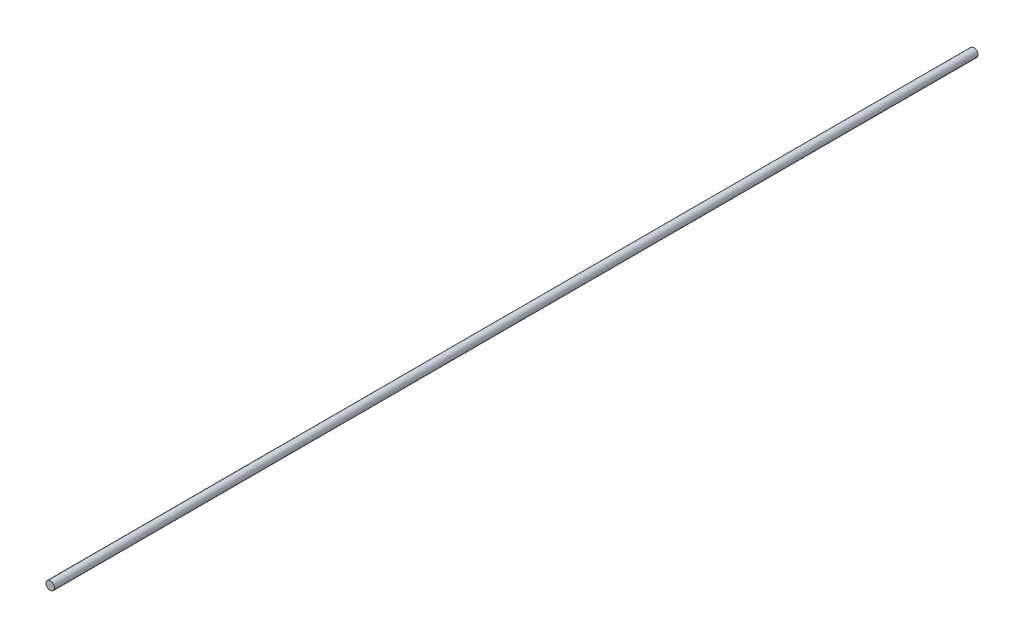
ISO-10303-21;
HEADER;
FILE_DESCRIPTION(('STEP AP214'),'2;1');
FILE_NAME('part.step','',(''),(''),'','','');
FILE_SCHEMA(('AUTOMOTIVE_DESIGN { 1 0 10303 214 1 1 1 1 }'));
ENDSEC;
DATA;
#1=APPLICATION_CONTEXT('core data for automotive mechanical design processes');
#2=APPLICATION_PROTOCOL_DEFINITION('international standard','automotive_design',2000,#1);
#3=PRODUCT_CONTEXT('',#1,'mechanical');
#4=PRODUCT('Part','Part','',(#3));
#5=PRODUCT_RELATED_PRODUCT_CATEGORY('part','',(#4));
#6=PRODUCT_DEFINITION_FORMATION('','',#4);
#7=PRODUCT_DEFINITION_CONTEXT('part definition',#1,'design');
#8=PRODUCT_DEFINITION('design','',#6,#7);
#9=PRODUCT_DEFINITION_SHAPE('','',#8);
#10=(LENGTH_UNIT() NAMED_UNIT(*) SI_UNIT(.MILLI.,.METRE.));
#11=(NAMED_UNIT(*) PLANE_ANGLE_UNIT() SI_UNIT($,.RADIAN.));
#12=(NAMED_UNIT(*) SI_UNIT($,.STERADIAN.) SOLID_ANGLE_UNIT());
#13=UNCERTAINTY_MEASURE_WITH_UNIT(LENGTH_MEASURE(1.E-05),#10,'distance_accuracy_value','');
#14=(GEOMETRIC_REPRESENTATION_CONTEXT(3) GLOBAL_UNCERTAINTY_ASSIGNED_CONTEXT((#13)) GLOBAL_UNIT_ASSIGNED_CONTEXT((#10,
#11,#12)) REPRESENTATION_CONTEXT('',''));
#15=CARTESIAN_POINT('',(0.,0.,0.));
#16=DIRECTION('',(0.,0.,1.));
#17=DIRECTION('',(1.,0.,0.));
#18=AXIS2_PLACEMENT_3D('',#15,#16,#17);
#19=CARTESIAN_POINT('',(0.,0.,220.));
#20=DIRECTION('',(0.,0.,-1.));
#21=DIRECTION('',(-1.,0.,0.));
#22=AXIS2_PLACEMENT_3D('',#19,#20,#21);
#23=CYLINDRICAL_SURFACE('',#22,1.);
#24=CARTESIAN_POINT('',(0.,0.,220.));
#25=DIRECTION('',(0.,0.,1.));
#26=DIRECTION('',(1.,0.,0.));
#27=AXIS2_PLACEMENT_3D('',#24,#25,#26);
#28=CIRCLE('',#27,1.);
#29=CARTESIAN_POINT('',(1.,0.,220.));
#30=VERTEX_POINT('',#29);
#31=EDGE_CURVE('E10',#30,#30,#28,.T.);
#32=ORIENTED_EDGE('',*,*,#31,.F.);
#33=EDGE_LOOP('',(#32));
#34=FACE_BOUND('',#33,.T.);
#35=CARTESIAN_POINT('',(0.,0.,0.));
#36=DIRECTION('',(0.,0.,1.));
#37=DIRECTION('',(1.,0.,0.));
#38=AXIS2_PLACEMENT_3D('',#35,#36,#37);
#39=CIRCLE('',#38,1.);
#40=CARTESIAN_POINT('',(1.,0.,0.));
#41=VERTEX_POINT('',#40);
#42=EDGE_CURVE('E38',#41,#41,#39,.T.);
#43=ORIENTED_EDGE('',*,*,#42,.T.);
#44=EDGE_LOOP('',(#43));
#45=FACE_BOUND('',#44,.T.);
#46=ADVANCED_FACE('F35',(#34,#45),#23,.T.);
#47=CARTESIAN_POINT('',(0.,0.,220.));
#48=DIRECTION('',(0.,0.,1.));
#49=DIRECTION('',(1.,0.,0.));
#50=AXIS2_PLACEMENT_3D('',#47,#48,#49);
#51=PLANE('',#50);
#52=ORIENTED_EDGE('',*,*,#31,.T.);
#53=EDGE_LOOP('',(#52));
#54=FACE_BOUND('',#53,.T.);
#55=ADVANCED_FACE('F50',(#54),#51,.T.);
#56=CARTESIAN_POINT('',(0.,0.,0.));
#57=DIRECTION('',(0.,0.,1.));
#58=DIRECTION('',(1.,0.,0.));
#59=AXIS2_PLACEMENT_3D('',#56,#57,#58);
#60=PLANE('',#59);
#61=ORIENTED_EDGE('',*,*,#42,.F.);
#62=EDGE_LOOP('',(#61));
#63=FACE_BOUND('',#62,.T.);
#64=ADVANCED_FACE('F48',(#63),#60,.F.);
#65=CLOSED_SHELL('',(#46,#55,#64));
#66=MANIFOLD_SOLID_BREP('B2',#65);
#67=ADVANCED_BREP_SHAPE_REPRESENTATION('',(#18,#66),#14);
#68=SHAPE_DEFINITION_REPRESENTATION(#9,#67);
ENDSEC;
END-ISO-10303-21;
